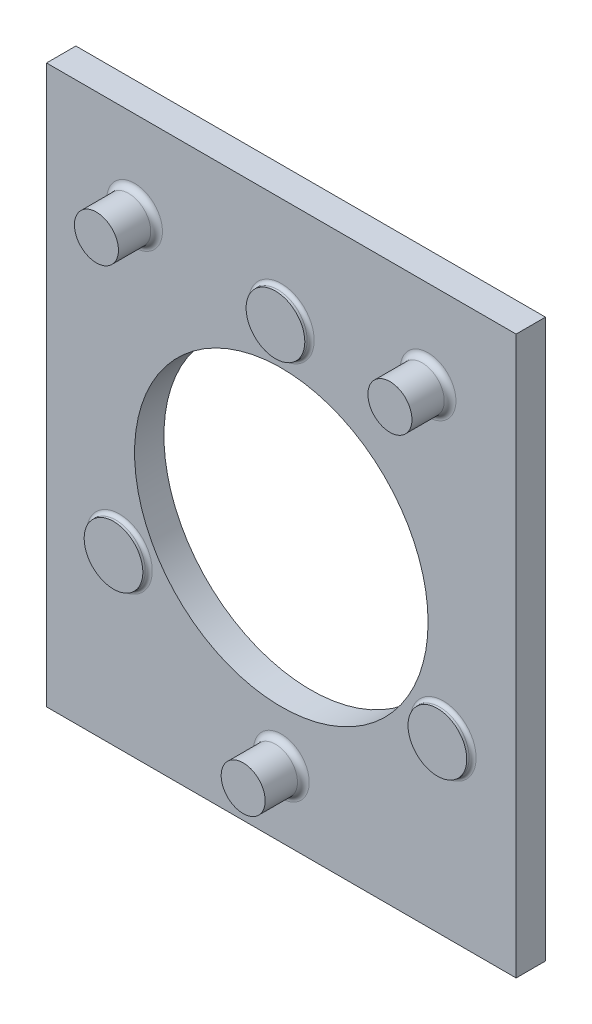
ISO-10303-21;
HEADER;
FILE_DESCRIPTION(('STEP AP214'),'2;1');
FILE_NAME('part.step','',(''),(''),'','','');
FILE_SCHEMA(('AUTOMOTIVE_DESIGN { 1 0 10303 214 1 1 1 1 }'));
ENDSEC;
DATA;
#1=APPLICATION_CONTEXT('core data for automotive mechanical design processes');
#2=APPLICATION_PROTOCOL_DEFINITION('international standard','automotive_design',2000,#1);
#3=PRODUCT_CONTEXT('',#1,'mechanical');
#4=PRODUCT('Part','Part','',(#3));
#5=PRODUCT_RELATED_PRODUCT_CATEGORY('part','',(#4));
#6=PRODUCT_DEFINITION_FORMATION('','',#4);
#7=PRODUCT_DEFINITION_CONTEXT('part definition',#1,'design');
#8=PRODUCT_DEFINITION('design','',#6,#7);
#9=PRODUCT_DEFINITION_SHAPE('','',#8);
#10=(LENGTH_UNIT() NAMED_UNIT(*) SI_UNIT(.MILLI.,.METRE.));
#11=(NAMED_UNIT(*) PLANE_ANGLE_UNIT() SI_UNIT($,.RADIAN.));
#12=(NAMED_UNIT(*) SI_UNIT($,.STERADIAN.) SOLID_ANGLE_UNIT());
#13=UNCERTAINTY_MEASURE_WITH_UNIT(LENGTH_MEASURE(1.E-05),#10,'distance_accuracy_value','');
#14=(GEOMETRIC_REPRESENTATION_CONTEXT(3) GLOBAL_UNCERTAINTY_ASSIGNED_CONTEXT((#13)) GLOBAL_UNIT_ASSIGNED_CONTEXT((#10,
#11,#12)) REPRESENTATION_CONTEXT('',''));
#15=CARTESIAN_POINT('',(0.,0.,0.));
#16=DIRECTION('',(0.,0.,1.));
#17=DIRECTION('',(1.,0.,0.));
#18=AXIS2_PLACEMENT_3D('',#15,#16,#17);
#19=CARTESIAN_POINT('',(0.,241.3,12.7));
#20=DIRECTION('',(0.,0.,-1.));
#21=DIRECTION('',(-1.,0.,0.));
#22=AXIS2_PLACEMENT_3D('',#19,#20,#21);
#23=PLANE('',#22);
#24=CARTESIAN_POINT('',(101.6,195.212789493481,12.7));
#25=DIRECTION('',(0.,0.,-1.));
#26=DIRECTION('',(-1.,0.,0.));
#27=AXIS2_PLACEMENT_3D('',#24,#25,#26);
#28=CIRCLE('',#27,14.224);
#29=CARTESIAN_POINT('',(87.376,195.212789493481,12.7));
#30=VERTEX_POINT('',#29);
#31=EDGE_CURVE('E142',#30,#30,#28,.T.);
#32=ORIENTED_EDGE('',*,*,#31,.T.);
#33=EDGE_LOOP('',(#32));
#34=FACE_BOUND('',#33,.T.);
#35=CARTESIAN_POINT('',(171.672531192417,73.8436052532595,12.7));
#36=DIRECTION('',(0.,0.,-1.));
#37=DIRECTION('',(-1.,0.,0.));
#38=AXIS2_PLACEMENT_3D('',#35,#36,#37);
#39=CIRCLE('',#38,14.224);
#40=CARTESIAN_POINT('',(157.448531192417,73.8436052532595,12.7));
#41=VERTEX_POINT('',#40);
#42=EDGE_CURVE('E139',#41,#41,#39,.T.);
#43=ORIENTED_EDGE('',*,*,#42,.T.);
#44=EDGE_LOOP('',(#43));
#45=FACE_BOUND('',#44,.T.);
#46=CARTESIAN_POINT('',(31.527468807583,73.8436052532596,12.7));
#47=DIRECTION('',(0.,0.,-1.));
#48=DIRECTION('',(-1.,0.,0.));
#49=AXIS2_PLACEMENT_3D('',#46,#47,#48);
#50=CIRCLE('',#49,14.224);
#51=CARTESIAN_POINT('',(17.303468807583,73.8436052532596,12.7));
#52=VERTEX_POINT('',#51);
#53=EDGE_CURVE('E136',#52,#52,#50,.T.);
#54=ORIENTED_EDGE('',*,*,#53,.T.);
#55=EDGE_LOOP('',(#54));
#56=FACE_BOUND('',#55,.T.);
#57=CARTESIAN_POINT('',(38.1,203.2,12.7));
#58=DIRECTION('',(0.,0.,-1.));
#59=DIRECTION('',(-1.,0.,0.));
#60=AXIS2_PLACEMENT_3D('',#57,#58,#59);
#61=CIRCLE('',#60,12.065);
#62=CARTESIAN_POINT('',(26.035,203.2,12.7));
#63=VERTEX_POINT('',#62);
#64=EDGE_CURVE('E124',#63,#63,#61,.T.);
#65=ORIENTED_EDGE('',*,*,#64,.T.);
#66=EDGE_LOOP('',(#65));
#67=FACE_BOUND('',#66,.T.);
#68=CARTESIAN_POINT('',(165.1,203.2,12.7));
#69=DIRECTION('',(0.,0.,-1.));
#70=DIRECTION('',(-1.,0.,0.));
#71=AXIS2_PLACEMENT_3D('',#68,#69,#70);
#72=CIRCLE('',#71,12.065);
#73=CARTESIAN_POINT('',(153.035,203.2,12.7));
#74=VERTEX_POINT('',#73);
#75=EDGE_CURVE('E121',#74,#74,#72,.T.);
#76=ORIENTED_EDGE('',*,*,#75,.T.);
#77=EDGE_LOOP('',(#76));
#78=FACE_BOUND('',#77,.T.);
#79=CARTESIAN_POINT('',(101.6,28.575,12.7));
#80=DIRECTION('',(0.,0.,-1.));
#81=DIRECTION('',(-1.,0.,0.));
#82=AXIS2_PLACEMENT_3D('',#79,#80,#81);
#83=CIRCLE('',#82,12.065);
#84=CARTESIAN_POINT('',(89.535,28.575,12.7));
#85=VERTEX_POINT('',#84);
#86=EDGE_CURVE('E118',#85,#85,#83,.T.);
#87=ORIENTED_EDGE('',*,*,#86,.T.);
#88=EDGE_LOOP('',(#87));
#89=FACE_BOUND('',#88,.T.);
#90=DIRECTION('',(0.,-1.,0.));
#91=VECTOR('',#90,1.);
#92=CARTESIAN_POINT('',(0.,0.,12.7));
#93=LINE('',#92,#91);
#94=CARTESIAN_POINT('',(0.,241.3,12.7));
#95=VERTEX_POINT('',#94);
#96=CARTESIAN_POINT('',(0.,0.,12.7));
#97=VERTEX_POINT('',#96);
#98=EDGE_CURVE('E90',#95,#97,#93,.T.);
#99=ORIENTED_EDGE('',*,*,#98,.T.);
#100=DIRECTION('',(1.,0.,0.));
#101=VECTOR('',#100,1.);
#102=CARTESIAN_POINT('',(0.,0.,12.7));
#103=LINE('',#102,#101);
#104=CARTESIAN_POINT('',(203.2,0.,12.7));
#105=VERTEX_POINT('',#104);
#106=EDGE_CURVE('E85',#97,#105,#103,.T.);
#107=ORIENTED_EDGE('',*,*,#106,.T.);
#108=DIRECTION('',(0.,1.,0.));
#109=VECTOR('',#108,1.);
#110=CARTESIAN_POINT('',(203.2,0.,12.7));
#111=LINE('',#110,#109);
#112=CARTESIAN_POINT('',(203.2,241.3,12.7));
#113=VERTEX_POINT('',#112);
#114=EDGE_CURVE('E88',#105,#113,#111,.T.);
#115=ORIENTED_EDGE('',*,*,#114,.T.);
#116=DIRECTION('',(-1.,0.,0.));
#117=VECTOR('',#116,1.);
#118=CARTESIAN_POINT('',(0.,241.3,12.7));
#119=LINE('',#118,#117);
#120=EDGE_CURVE('E54',#113,#95,#119,.T.);
#121=ORIENTED_EDGE('',*,*,#120,.T.);
#122=EDGE_LOOP('',(#99,#107,#115,#121));
#123=FACE_BOUND('',#122,.T.);
#124=CARTESIAN_POINT('',(101.6,114.3,12.7));
#125=DIRECTION('',(0.,0.,1.));
#126=DIRECTION('',(1.,0.,0.));
#127=AXIS2_PLACEMENT_3D('',#124,#125,#126);
#128=CIRCLE('',#127,63.5);
#129=CARTESIAN_POINT('',(165.1,114.3,12.7));
#130=VERTEX_POINT('',#129);
#131=EDGE_CURVE('E108',#130,#130,#128,.T.);
#132=ORIENTED_EDGE('',*,*,#131,.F.);
#133=EDGE_LOOP('',(#132));
#134=FACE_BOUND('',#133,.T.);
#135=ADVANCED_FACE('F37',(#34,#45,#56,#67,#78,#89,#123,#134),#23,.F.);
#136=CARTESIAN_POINT('',(0.,241.3,0.));
#137=DIRECTION('',(0.,0.,-1.));
#138=DIRECTION('',(-1.,0.,0.));
#139=AXIS2_PLACEMENT_3D('',#136,#137,#138);
#140=PLANE('',#139);
#141=DIRECTION('',(0.,-1.,0.));
#142=VECTOR('',#141,1.);
#143=CARTESIAN_POINT('',(0.,0.,0.));
#144=LINE('',#143,#142);
#145=CARTESIAN_POINT('',(0.,241.3,0.));
#146=VERTEX_POINT('',#145);
#147=CARTESIAN_POINT('',(0.,0.,0.));
#148=VERTEX_POINT('',#147);
#149=EDGE_CURVE('E105',#146,#148,#144,.T.);
#150=ORIENTED_EDGE('',*,*,#149,.F.);
#151=DIRECTION('',(-1.,0.,0.));
#152=VECTOR('',#151,1.);
#153=CARTESIAN_POINT('',(0.,241.3,0.));
#154=LINE('',#153,#152);
#155=CARTESIAN_POINT('',(203.2,241.3,0.));
#156=VERTEX_POINT('',#155);
#157=EDGE_CURVE('E77',#156,#146,#154,.T.);
#158=ORIENTED_EDGE('',*,*,#157,.F.);
#159=DIRECTION('',(0.,1.,0.));
#160=VECTOR('',#159,1.);
#161=CARTESIAN_POINT('',(203.2,0.,0.));
#162=LINE('',#161,#160);
#163=CARTESIAN_POINT('',(203.2,0.,0.));
#164=VERTEX_POINT('',#163);
#165=EDGE_CURVE('E71',#164,#156,#162,.T.);
#166=ORIENTED_EDGE('',*,*,#165,.F.);
#167=DIRECTION('',(1.,0.,0.));
#168=VECTOR('',#167,1.);
#169=CARTESIAN_POINT('',(0.,0.,0.));
#170=LINE('',#169,#168);
#171=EDGE_CURVE('E95',#148,#164,#170,.T.);
#172=ORIENTED_EDGE('',*,*,#171,.F.);
#173=EDGE_LOOP('',(#150,#158,#166,#172));
#174=FACE_BOUND('',#173,.T.);
#175=CARTESIAN_POINT('',(101.6,114.3,0.));
#176=DIRECTION('',(0.,0.,1.));
#177=DIRECTION('',(1.,0.,0.));
#178=AXIS2_PLACEMENT_3D('',#175,#176,#177);
#179=CIRCLE('',#178,63.5);
#180=CARTESIAN_POINT('',(165.1,114.3,0.));
#181=VERTEX_POINT('',#180);
#182=EDGE_CURVE('E231',#181,#181,#179,.T.);
#183=ORIENTED_EDGE('',*,*,#182,.T.);
#184=EDGE_LOOP('',(#183));
#185=FACE_BOUND('',#184,.T.);
#186=ADVANCED_FACE('F164',(#174,#185),#140,.T.);
#187=CARTESIAN_POINT('',(0.,0.,12.7));
#188=DIRECTION('',(1.,0.,0.));
#189=DIRECTION('',(0.,0.,-1.));
#190=AXIS2_PLACEMENT_3D('',#187,#188,#189);
#191=PLANE('',#190);
#192=ORIENTED_EDGE('',*,*,#149,.T.);
#193=DIRECTION('',(0.,0.,-1.));
#194=VECTOR('',#193,1.);
#195=CARTESIAN_POINT('',(0.,0.,12.7));
#196=LINE('',#195,#194);
#197=EDGE_CURVE('E96',#97,#148,#196,.T.);
#198=ORIENTED_EDGE('',*,*,#197,.F.);
#199=ORIENTED_EDGE('',*,*,#98,.F.);
#200=DIRECTION('',(0.,0.,-1.));
#201=VECTOR('',#200,1.);
#202=CARTESIAN_POINT('',(0.,241.3,12.7));
#203=LINE('',#202,#201);
#204=EDGE_CURVE('E101',#95,#146,#203,.T.);
#205=ORIENTED_EDGE('',*,*,#204,.T.);
#206=EDGE_LOOP('',(#192,#198,#199,#205));
#207=FACE_BOUND('',#206,.T.);
#208=ADVANCED_FACE('F170',(#207),#191,.F.);
#209=CARTESIAN_POINT('',(0.,0.,12.7));
#210=DIRECTION('',(0.,1.,0.));
#211=DIRECTION('',(0.,0.,1.));
#212=AXIS2_PLACEMENT_3D('',#209,#210,#211);
#213=PLANE('',#212);
#214=ORIENTED_EDGE('',*,*,#171,.T.);
#215=DIRECTION('',(0.,0.,-1.));
#216=VECTOR('',#215,1.);
#217=CARTESIAN_POINT('',(203.2,0.,12.7));
#218=LINE('',#217,#216);
#219=EDGE_CURVE('E93',#105,#164,#218,.T.);
#220=ORIENTED_EDGE('',*,*,#219,.F.);
#221=ORIENTED_EDGE('',*,*,#106,.F.);
#222=ORIENTED_EDGE('',*,*,#197,.T.);
#223=EDGE_LOOP('',(#214,#220,#221,#222));
#224=FACE_BOUND('',#223,.T.);
#225=ADVANCED_FACE('F94',(#224),#213,.F.);
#226=CARTESIAN_POINT('',(203.2,0.,12.7));
#227=DIRECTION('',(-1.,0.,0.));
#228=DIRECTION('',(0.,0.,1.));
#229=AXIS2_PLACEMENT_3D('',#226,#227,#228);
#230=PLANE('',#229);
#231=ORIENTED_EDGE('',*,*,#165,.T.);
#232=DIRECTION('',(0.,0.,-1.));
#233=VECTOR('',#232,1.);
#234=CARTESIAN_POINT('',(203.2,241.3,12.7));
#235=LINE('',#234,#233);
#236=EDGE_CURVE('E97',#113,#156,#235,.T.);
#237=ORIENTED_EDGE('',*,*,#236,.F.);
#238=ORIENTED_EDGE('',*,*,#114,.F.);
#239=ORIENTED_EDGE('',*,*,#219,.T.);
#240=EDGE_LOOP('',(#231,#237,#238,#239));
#241=FACE_BOUND('',#240,.T.);
#242=ADVANCED_FACE('F99',(#241),#230,.F.);
#243=CARTESIAN_POINT('',(0.,241.3,12.7));
#244=DIRECTION('',(0.,-1.,0.));
#245=DIRECTION('',(0.,0.,-1.));
#246=AXIS2_PLACEMENT_3D('',#243,#244,#245);
#247=PLANE('',#246);
#248=ORIENTED_EDGE('',*,*,#157,.T.);
#249=ORIENTED_EDGE('',*,*,#204,.F.);
#250=ORIENTED_EDGE('',*,*,#120,.F.);
#251=ORIENTED_EDGE('',*,*,#236,.T.);
#252=EDGE_LOOP('',(#248,#249,#250,#251));
#253=FACE_BOUND('',#252,.T.);
#254=ADVANCED_FACE('F178',(#253),#247,.F.);
#255=CARTESIAN_POINT('',(101.6,114.3,12.7));
#256=DIRECTION('',(0.,0.,-1.));
#257=DIRECTION('',(-1.,0.,0.));
#258=AXIS2_PLACEMENT_3D('',#255,#256,#257);
#259=CYLINDRICAL_SURFACE('',#258,63.5);
#260=ORIENTED_EDGE('',*,*,#131,.T.);
#261=EDGE_LOOP('',(#260));
#262=FACE_BOUND('',#261,.T.);
#263=ORIENTED_EDGE('',*,*,#182,.F.);
#264=EDGE_LOOP('',(#263));
#265=FACE_BOUND('',#264,.T.);
#266=ADVANCED_FACE('F175',(#262,#265),#259,.F.);
#267=CARTESIAN_POINT('',(31.527468807583,73.8436052532596,15.24));
#268=DIRECTION('',(0.,0.,-1.));
#269=DIRECTION('',(-1.,0.,0.));
#270=AXIS2_PLACEMENT_3D('',#267,#268,#269);
#271=CYLINDRICAL_SURFACE('',#270,12.7);
#272=CARTESIAN_POINT('',(31.527468807583,73.8436052532596,14.224));
#273=DIRECTION('',(0.,0.,-1.));
#274=DIRECTION('',(-1.,0.,0.));
#275=AXIS2_PLACEMENT_3D('',#272,#273,#274);
#276=CIRCLE('',#275,12.7);
#277=CARTESIAN_POINT('',(18.827468807583,73.8436052532596,14.224));
#278=VERTEX_POINT('',#277);
#279=EDGE_CURVE('E11',#278,#278,#276,.F.);
#280=ORIENTED_EDGE('',*,*,#279,.T.);
#281=EDGE_LOOP('',(#280));
#282=FACE_BOUND('',#281,.T.);
#283=CARTESIAN_POINT('',(31.527468807583,73.8436052532596,15.24));
#284=DIRECTION('',(0.,0.,1.));
#285=DIRECTION('',(1.,0.,0.));
#286=AXIS2_PLACEMENT_3D('',#283,#284,#285);
#287=CIRCLE('',#286,12.7);
#288=CARTESIAN_POINT('',(44.227468807583,73.8436052532596,15.24));
#289=VERTEX_POINT('',#288);
#290=EDGE_CURVE('E228',#289,#289,#287,.T.);
#291=ORIENTED_EDGE('',*,*,#290,.F.);
#292=EDGE_LOOP('',(#291));
#293=FACE_BOUND('',#292,.T.);
#294=ADVANCED_FACE('F239',(#282,#293),#271,.T.);
#295=CARTESIAN_POINT('',(31.527468807583,73.8436052532596,15.24));
#296=DIRECTION('',(0.,0.,1.));
#297=DIRECTION('',(1.,0.,0.));
#298=AXIS2_PLACEMENT_3D('',#295,#296,#297);
#299=PLANE('',#298);
#300=ORIENTED_EDGE('',*,*,#290,.T.);
#301=EDGE_LOOP('',(#300));
#302=FACE_BOUND('',#301,.T.);
#303=ADVANCED_FACE('F244',(#302),#299,.T.);
#304=CARTESIAN_POINT('',(101.6,195.212789493481,15.24));
#305=DIRECTION('',(0.,0.,-1.));
#306=DIRECTION('',(-1.,0.,0.));
#307=AXIS2_PLACEMENT_3D('',#304,#305,#306);
#308=CYLINDRICAL_SURFACE('',#307,12.7);
#309=CARTESIAN_POINT('',(101.6,195.212789493481,14.224));
#310=DIRECTION('',(0.,0.,-1.));
#311=DIRECTION('',(-1.,0.,0.));
#312=AXIS2_PLACEMENT_3D('',#309,#310,#311);
#313=CIRCLE('',#312,12.7);
#314=CARTESIAN_POINT('',(88.9,195.212789493481,14.224));
#315=VERTEX_POINT('',#314);
#316=EDGE_CURVE('E133',#315,#315,#313,.F.);
#317=ORIENTED_EDGE('',*,*,#316,.T.);
#318=EDGE_LOOP('',(#317));
#319=FACE_BOUND('',#318,.T.);
#320=CARTESIAN_POINT('',(101.6,195.212789493481,15.24));
#321=DIRECTION('',(0.,0.,1.));
#322=DIRECTION('',(1.,0.,0.));
#323=AXIS2_PLACEMENT_3D('',#320,#321,#322);
#324=CIRCLE('',#323,12.7);
#325=CARTESIAN_POINT('',(114.3,195.212789493481,15.24));
#326=VERTEX_POINT('',#325);
#327=EDGE_CURVE('E225',#326,#326,#324,.T.);
#328=ORIENTED_EDGE('',*,*,#327,.F.);
#329=EDGE_LOOP('',(#328));
#330=FACE_BOUND('',#329,.T.);
#331=ADVANCED_FACE('F250',(#319,#330),#308,.T.);
#332=CARTESIAN_POINT('',(101.6,195.212789493481,15.24));
#333=DIRECTION('',(0.,0.,1.));
#334=DIRECTION('',(1.,0.,0.));
#335=AXIS2_PLACEMENT_3D('',#332,#333,#334);
#336=PLANE('',#335);
#337=ORIENTED_EDGE('',*,*,#327,.T.);
#338=EDGE_LOOP('',(#337));
#339=FACE_BOUND('',#338,.T.);
#340=ADVANCED_FACE('F257',(#339),#336,.T.);
#341=CARTESIAN_POINT('',(171.672531192417,73.8436052532595,15.24));
#342=DIRECTION('',(0.,0.,-1.));
#343=DIRECTION('',(-1.,0.,0.));
#344=AXIS2_PLACEMENT_3D('',#341,#342,#343);
#345=CYLINDRICAL_SURFACE('',#344,12.7);
#346=CARTESIAN_POINT('',(171.672531192417,73.8436052532595,14.224));
#347=DIRECTION('',(0.,0.,-1.));
#348=DIRECTION('',(-1.,0.,0.));
#349=AXIS2_PLACEMENT_3D('',#346,#347,#348);
#350=CIRCLE('',#349,12.7);
#351=CARTESIAN_POINT('',(158.972531192417,73.8436052532595,14.224));
#352=VERTEX_POINT('',#351);
#353=EDGE_CURVE('E46',#352,#352,#350,.F.);
#354=ORIENTED_EDGE('',*,*,#353,.T.);
#355=EDGE_LOOP('',(#354));
#356=FACE_BOUND('',#355,.T.);
#357=CARTESIAN_POINT('',(171.672531192417,73.8436052532595,15.24));
#358=DIRECTION('',(0.,0.,1.));
#359=DIRECTION('',(1.,0.,0.));
#360=AXIS2_PLACEMENT_3D('',#357,#358,#359);
#361=CIRCLE('',#360,12.7);
#362=CARTESIAN_POINT('',(184.372531192417,73.8436052532595,15.24));
#363=VERTEX_POINT('',#362);
#364=EDGE_CURVE('E222',#363,#363,#361,.T.);
#365=ORIENTED_EDGE('',*,*,#364,.F.);
#366=EDGE_LOOP('',(#365));
#367=FACE_BOUND('',#366,.T.);
#368=ADVANCED_FACE('F147',(#356,#367),#345,.T.);
#369=CARTESIAN_POINT('',(171.672531192417,73.8436052532595,15.24));
#370=DIRECTION('',(0.,0.,1.));
#371=DIRECTION('',(1.,0.,0.));
#372=AXIS2_PLACEMENT_3D('',#369,#370,#371);
#373=PLANE('',#372);
#374=ORIENTED_EDGE('',*,*,#364,.T.);
#375=EDGE_LOOP('',(#374));
#376=FACE_BOUND('',#375,.T.);
#377=ADVANCED_FACE('F264',(#376),#373,.T.);
#378=CARTESIAN_POINT('',(38.1,203.2,29.21));
#379=DIRECTION('',(0.,0.,-1.));
#380=DIRECTION('',(-1.,0.,0.));
#381=AXIS2_PLACEMENT_3D('',#378,#379,#380);
#382=CYLINDRICAL_SURFACE('',#381,9.525);
#383=CARTESIAN_POINT('',(38.1,203.2,15.24));
#384=DIRECTION('',(0.,0.,-1.));
#385=DIRECTION('',(-1.,0.,0.));
#386=AXIS2_PLACEMENT_3D('',#383,#384,#385);
#387=CIRCLE('',#386,9.525);
#388=CARTESIAN_POINT('',(28.575,203.2,15.24));
#389=VERTEX_POINT('',#388);
#390=EDGE_CURVE('E115',#389,#389,#387,.F.);
#391=ORIENTED_EDGE('',*,*,#390,.T.);
#392=EDGE_LOOP('',(#391));
#393=FACE_BOUND('',#392,.T.);
#394=CARTESIAN_POINT('',(38.1,203.2,29.21));
#395=DIRECTION('',(0.,0.,1.));
#396=DIRECTION('',(1.,0.,0.));
#397=AXIS2_PLACEMENT_3D('',#394,#395,#396);
#398=CIRCLE('',#397,9.525);
#399=CARTESIAN_POINT('',(47.625,203.2,29.21));
#400=VERTEX_POINT('',#399);
#401=EDGE_CURVE('E217',#400,#400,#398,.T.);
#402=ORIENTED_EDGE('',*,*,#401,.F.);
#403=EDGE_LOOP('',(#402));
#404=FACE_BOUND('',#403,.T.);
#405=ADVANCED_FACE('F267',(#393,#404),#382,.T.);
#406=CARTESIAN_POINT('',(38.1,203.2,29.21));
#407=DIRECTION('',(0.,0.,1.));
#408=DIRECTION('',(1.,0.,0.));
#409=AXIS2_PLACEMENT_3D('',#406,#407,#408);
#410=PLANE('',#409);
#411=ORIENTED_EDGE('',*,*,#401,.T.);
#412=EDGE_LOOP('',(#411));
#413=FACE_BOUND('',#412,.T.);
#414=ADVANCED_FACE('F271',(#413),#410,.T.);
#415=CARTESIAN_POINT('',(165.1,203.2,29.21));
#416=DIRECTION('',(0.,0.,-1.));
#417=DIRECTION('',(-1.,0.,0.));
#418=AXIS2_PLACEMENT_3D('',#415,#416,#417);
#419=CYLINDRICAL_SURFACE('',#418,9.52499999999999);
#420=CARTESIAN_POINT('',(165.1,203.2,15.24));
#421=DIRECTION('',(0.,0.,-1.));
#422=DIRECTION('',(-1.,0.,0.));
#423=AXIS2_PLACEMENT_3D('',#420,#421,#422);
#424=CIRCLE('',#423,9.52499999999999);
#425=CARTESIAN_POINT('',(155.575,203.2,15.24));
#426=VERTEX_POINT('',#425);
#427=EDGE_CURVE('E127',#426,#426,#424,.F.);
#428=ORIENTED_EDGE('',*,*,#427,.T.);
#429=EDGE_LOOP('',(#428));
#430=FACE_BOUND('',#429,.T.);
#431=CARTESIAN_POINT('',(165.1,203.2,29.21));
#432=DIRECTION('',(0.,0.,1.));
#433=DIRECTION('',(1.,0.,0.));
#434=AXIS2_PLACEMENT_3D('',#431,#432,#433);
#435=CIRCLE('',#434,9.52499999999999);
#436=CARTESIAN_POINT('',(174.625,203.2,29.21));
#437=VERTEX_POINT('',#436);
#438=EDGE_CURVE('E214',#437,#437,#435,.T.);
#439=ORIENTED_EDGE('',*,*,#438,.F.);
#440=EDGE_LOOP('',(#439));
#441=FACE_BOUND('',#440,.T.);
#442=ADVANCED_FACE('F275',(#430,#441),#419,.T.);
#443=CARTESIAN_POINT('',(165.1,203.2,29.21));
#444=DIRECTION('',(0.,0.,1.));
#445=DIRECTION('',(1.,0.,0.));
#446=AXIS2_PLACEMENT_3D('',#443,#444,#445);
#447=PLANE('',#446);
#448=ORIENTED_EDGE('',*,*,#438,.T.);
#449=EDGE_LOOP('',(#448));
#450=FACE_BOUND('',#449,.T.);
#451=ADVANCED_FACE('F208',(#450),#447,.T.);
#452=CARTESIAN_POINT('',(101.6,28.575,29.21));
#453=DIRECTION('',(0.,0.,-1.));
#454=DIRECTION('',(-1.,0.,0.));
#455=AXIS2_PLACEMENT_3D('',#452,#453,#454);
#456=CYLINDRICAL_SURFACE('',#455,9.52500000000001);
#457=CARTESIAN_POINT('',(101.6,28.575,15.24));
#458=DIRECTION('',(0.,0.,-1.));
#459=DIRECTION('',(-1.,0.,0.));
#460=AXIS2_PLACEMENT_3D('',#457,#458,#459);
#461=CIRCLE('',#460,9.52500000000001);
#462=CARTESIAN_POINT('',(92.075,28.575,15.24));
#463=VERTEX_POINT('',#462);
#464=EDGE_CURVE('E130',#463,#463,#461,.F.);
#465=ORIENTED_EDGE('',*,*,#464,.T.);
#466=EDGE_LOOP('',(#465));
#467=FACE_BOUND('',#466,.T.);
#468=CARTESIAN_POINT('',(101.6,28.575,29.21));
#469=DIRECTION('',(0.,0.,1.));
#470=DIRECTION('',(1.,0.,0.));
#471=AXIS2_PLACEMENT_3D('',#468,#469,#470);
#472=CIRCLE('',#471,9.52500000000001);
#473=CARTESIAN_POINT('',(111.125,28.575,29.21));
#474=VERTEX_POINT('',#473);
#475=EDGE_CURVE('E212',#474,#474,#472,.T.);
#476=ORIENTED_EDGE('',*,*,#475,.F.);
#477=EDGE_LOOP('',(#476));
#478=FACE_BOUND('',#477,.T.);
#479=ADVANCED_FACE('F205',(#467,#478),#456,.T.);
#480=CARTESIAN_POINT('',(101.6,28.575,29.21));
#481=DIRECTION('',(0.,0.,1.));
#482=DIRECTION('',(1.,0.,0.));
#483=AXIS2_PLACEMENT_3D('',#480,#481,#482);
#484=PLANE('',#483);
#485=ORIENTED_EDGE('',*,*,#475,.T.);
#486=EDGE_LOOP('',(#485));
#487=FACE_BOUND('',#486,.T.);
#488=ADVANCED_FACE('F192',(#487),#484,.T.);
#489=CARTESIAN_POINT('',(38.1,203.2,15.24));
#490=DIRECTION('',(0.,0.,-1.));
#491=DIRECTION('',(-1.,0.,0.));
#492=AXIS2_PLACEMENT_3D('',#489,#490,#491);
#493=TOROIDAL_SURFACE('',#492,12.065,2.54);
#494=ORIENTED_EDGE('',*,*,#64,.F.);
#495=EDGE_LOOP('',(#494));
#496=FACE_BOUND('',#495,.T.);
#497=ORIENTED_EDGE('',*,*,#390,.F.);
#498=EDGE_LOOP('',(#497));
#499=FACE_BOUND('',#498,.T.);
#500=ADVANCED_FACE('F188',(#496,#499),#493,.F.);
#501=CARTESIAN_POINT('',(165.1,203.2,15.24));
#502=DIRECTION('',(0.,0.,-1.));
#503=DIRECTION('',(-1.,0.,0.));
#504=AXIS2_PLACEMENT_3D('',#501,#502,#503);
#505=TOROIDAL_SURFACE('',#504,12.065,2.54);
#506=ORIENTED_EDGE('',*,*,#75,.F.);
#507=EDGE_LOOP('',(#506));
#508=FACE_BOUND('',#507,.T.);
#509=ORIENTED_EDGE('',*,*,#427,.F.);
#510=EDGE_LOOP('',(#509));
#511=FACE_BOUND('',#510,.T.);
#512=ADVANCED_FACE('F191',(#508,#511),#505,.F.);
#513=CARTESIAN_POINT('',(101.6,28.575,15.24));
#514=DIRECTION('',(0.,0.,-1.));
#515=DIRECTION('',(-1.,0.,0.));
#516=AXIS2_PLACEMENT_3D('',#513,#514,#515);
#517=TOROIDAL_SURFACE('',#516,12.065,2.54);
#518=ORIENTED_EDGE('',*,*,#86,.F.);
#519=EDGE_LOOP('',(#518));
#520=FACE_BOUND('',#519,.T.);
#521=ORIENTED_EDGE('',*,*,#464,.F.);
#522=EDGE_LOOP('',(#521));
#523=FACE_BOUND('',#522,.T.);
#524=ADVANCED_FACE('F159',(#520,#523),#517,.F.);
#525=CARTESIAN_POINT('',(101.6,195.212789493481,14.224));
#526=DIRECTION('',(0.,0.,-1.));
#527=DIRECTION('',(-1.,0.,0.));
#528=AXIS2_PLACEMENT_3D('',#525,#526,#527);
#529=TOROIDAL_SURFACE('',#528,14.224,1.524);
#530=ORIENTED_EDGE('',*,*,#31,.F.);
#531=EDGE_LOOP('',(#530));
#532=FACE_BOUND('',#531,.T.);
#533=ORIENTED_EDGE('',*,*,#316,.F.);
#534=EDGE_LOOP('',(#533));
#535=FACE_BOUND('',#534,.T.);
#536=ADVANCED_FACE('F152',(#532,#535),#529,.F.);
#537=CARTESIAN_POINT('',(171.672531192417,73.8436052532595,14.224));
#538=DIRECTION('',(0.,0.,-1.));
#539=DIRECTION('',(-1.,0.,0.));
#540=AXIS2_PLACEMENT_3D('',#537,#538,#539);
#541=TOROIDAL_SURFACE('',#540,14.224,1.524);
#542=ORIENTED_EDGE('',*,*,#42,.F.);
#543=EDGE_LOOP('',(#542));
#544=FACE_BOUND('',#543,.T.);
#545=ORIENTED_EDGE('',*,*,#353,.F.);
#546=EDGE_LOOP('',(#545));
#547=FACE_BOUND('',#546,.T.);
#548=ADVANCED_FACE('F150',(#544,#547),#541,.F.);
#549=CARTESIAN_POINT('',(31.527468807583,73.8436052532596,14.224));
#550=DIRECTION('',(0.,0.,-1.));
#551=DIRECTION('',(-1.,0.,0.));
#552=AXIS2_PLACEMENT_3D('',#549,#550,#551);
#553=TOROIDAL_SURFACE('',#552,14.224,1.524);
#554=ORIENTED_EDGE('',*,*,#53,.F.);
#555=EDGE_LOOP('',(#554));
#556=FACE_BOUND('',#555,.T.);
#557=ORIENTED_EDGE('',*,*,#279,.F.);
#558=EDGE_LOOP('',(#557));
#559=FACE_BOUND('',#558,.T.);
#560=ADVANCED_FACE('F39',(#556,#559),#553,.F.);
#561=CLOSED_SHELL('',(#135,#186,#208,#225,#242,#254,#266,#294,#303,#331,#340,#368,#377,#405,
#414,#442,#451,#479,#488,#500,#512,#524,#536,#548,#560));
#562=MANIFOLD_SOLID_BREP('B2',#561);
#563=ADVANCED_BREP_SHAPE_REPRESENTATION('',(#18,#562),#14);
#564=SHAPE_DEFINITION_REPRESENTATION(#9,#563);
ENDSEC;
END-ISO-10303-21;
